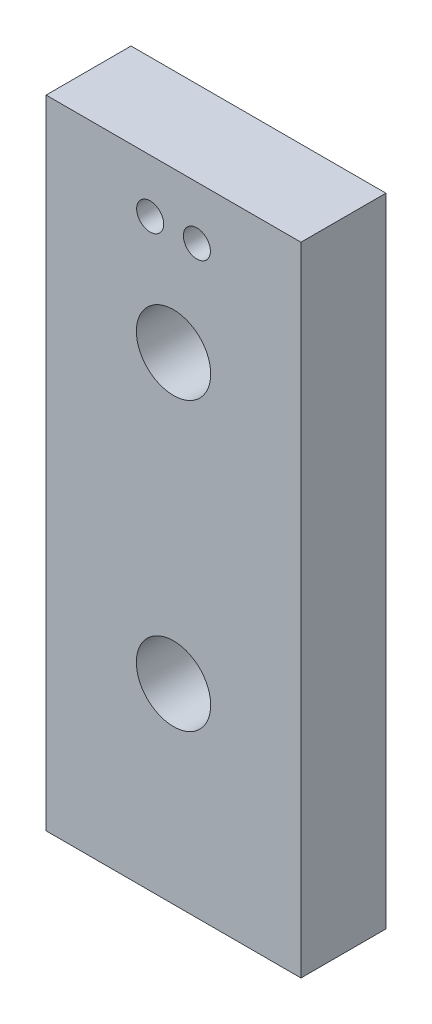
ISO-10303-21;
HEADER;
FILE_DESCRIPTION(('STEP AP214'),'2;1');
FILE_NAME('part.step','',(''),(''),'','','');
FILE_SCHEMA(('AUTOMOTIVE_DESIGN { 1 0 10303 214 1 1 1 1 }'));
ENDSEC;
DATA;
#1=APPLICATION_CONTEXT('core data for automotive mechanical design processes');
#2=APPLICATION_PROTOCOL_DEFINITION('international standard','automotive_design',2000,#1);
#3=PRODUCT_CONTEXT('',#1,'mechanical');
#4=PRODUCT('Part','Part','',(#3));
#5=PRODUCT_RELATED_PRODUCT_CATEGORY('part','',(#4));
#6=PRODUCT_DEFINITION_FORMATION('','',#4);
#7=PRODUCT_DEFINITION_CONTEXT('part definition',#1,'design');
#8=PRODUCT_DEFINITION('design','',#6,#7);
#9=PRODUCT_DEFINITION_SHAPE('','',#8);
#10=(LENGTH_UNIT() NAMED_UNIT(*) SI_UNIT(.MILLI.,.METRE.));
#11=(NAMED_UNIT(*) PLANE_ANGLE_UNIT() SI_UNIT($,.RADIAN.));
#12=(NAMED_UNIT(*) SI_UNIT($,.STERADIAN.) SOLID_ANGLE_UNIT());
#13=UNCERTAINTY_MEASURE_WITH_UNIT(LENGTH_MEASURE(1.E-05),#10,'distance_accuracy_value','');
#14=(GEOMETRIC_REPRESENTATION_CONTEXT(3) GLOBAL_UNCERTAINTY_ASSIGNED_CONTEXT((#13)) GLOBAL_UNIT_ASSIGNED_CONTEXT((#10,
#11,#12)) REPRESENTATION_CONTEXT('',''));
#15=CARTESIAN_POINT('',(0.,0.,0.));
#16=DIRECTION('',(0.,0.,1.));
#17=DIRECTION('',(1.,0.,0.));
#18=AXIS2_PLACEMENT_3D('',#15,#16,#17);
#19=CARTESIAN_POINT('',(0.,0.,12.7));
#20=DIRECTION('',(0.,0.,-1.));
#21=DIRECTION('',(-1.,0.,0.));
#22=AXIS2_PLACEMENT_3D('',#19,#20,#21);
#23=PLANE('',#22);
#24=CARTESIAN_POINT('',(-3.49250000000001,87.3125,12.7));
#25=DIRECTION('',(0.,0.,1.));
#26=DIRECTION('',(1.,0.,0.));
#27=AXIS2_PLACEMENT_3D('',#24,#25,#26);
#28=CIRCLE('',#27,2.01929999999999);
#29=CARTESIAN_POINT('',(-1.47320000000002,87.3125,12.7));
#30=VERTEX_POINT('',#29);
#31=EDGE_CURVE('E214',#30,#30,#28,.T.);
#32=ORIENTED_EDGE('',*,*,#31,.F.);
#33=EDGE_LOOP('',(#32));
#34=FACE_BOUND('',#33,.T.);
#35=CARTESIAN_POINT('',(3.49249999999999,87.3125,12.7));
#36=DIRECTION('',(0.,0.,1.));
#37=DIRECTION('',(1.,0.,0.));
#38=AXIS2_PLACEMENT_3D('',#35,#36,#37);
#39=CIRCLE('',#38,2.01929999999999);
#40=CARTESIAN_POINT('',(5.51179999999998,87.3125,12.7));
#41=VERTEX_POINT('',#40);
#42=EDGE_CURVE('E216',#41,#41,#39,.T.);
#43=ORIENTED_EDGE('',*,*,#42,.F.);
#44=EDGE_LOOP('',(#43));
#45=FACE_BOUND('',#44,.T.);
#46=CARTESIAN_POINT('',(0.,28.575,12.7));
#47=DIRECTION('',(0.,0.,1.));
#48=DIRECTION('',(1.,0.,0.));
#49=AXIS2_PLACEMENT_3D('',#46,#47,#48);
#50=CIRCLE('',#49,5.55625);
#51=CARTESIAN_POINT('',(5.55625,28.575,12.7));
#52=VERTEX_POINT('',#51);
#53=EDGE_CURVE('E134',#52,#52,#50,.T.);
#54=ORIENTED_EDGE('',*,*,#53,.F.);
#55=EDGE_LOOP('',(#54));
#56=FACE_BOUND('',#55,.T.);
#57=DIRECTION('',(0.,-1.,0.));
#58=VECTOR('',#57,1.);
#59=CARTESIAN_POINT('',(-19.05,0.,12.7));
#60=LINE('',#59,#58);
#61=CARTESIAN_POINT('',(-19.05,95.25,12.7));
#62=VERTEX_POINT('',#61);
#63=CARTESIAN_POINT('',(-19.05,0.,12.7));
#64=VERTEX_POINT('',#63);
#65=EDGE_CURVE('E140',#62,#64,#60,.T.);
#66=ORIENTED_EDGE('',*,*,#65,.T.);
#67=DIRECTION('',(1.,0.,0.));
#68=VECTOR('',#67,1.);
#69=CARTESIAN_POINT('',(-19.05,0.,12.7));
#70=LINE('',#69,#68);
#71=CARTESIAN_POINT('',(19.05,0.,12.7));
#72=VERTEX_POINT('',#71);
#73=EDGE_CURVE('E97',#64,#72,#70,.T.);
#74=ORIENTED_EDGE('',*,*,#73,.T.);
#75=DIRECTION('',(0.,1.,0.));
#76=VECTOR('',#75,1.);
#77=CARTESIAN_POINT('',(19.05,0.,12.7));
#78=LINE('',#77,#76);
#79=CARTESIAN_POINT('',(19.05,95.25,12.7));
#80=VERTEX_POINT('',#79);
#81=EDGE_CURVE('E143',#72,#80,#78,.T.);
#82=ORIENTED_EDGE('',*,*,#81,.T.);
#83=DIRECTION('',(-1.,0.,0.));
#84=VECTOR('',#83,1.);
#85=CARTESIAN_POINT('',(-19.05,95.25,12.7));
#86=LINE('',#85,#84);
#87=EDGE_CURVE('E66',#80,#62,#86,.T.);
#88=ORIENTED_EDGE('',*,*,#87,.T.);
#89=EDGE_LOOP('',(#66,#74,#82,#88));
#90=FACE_BOUND('',#89,.T.);
#91=CARTESIAN_POINT('',(0.,71.4375,12.7));
#92=DIRECTION('',(0.,0.,1.));
#93=DIRECTION('',(1.,0.,0.));
#94=AXIS2_PLACEMENT_3D('',#91,#92,#93);
#95=CIRCLE('',#94,5.55625);
#96=CARTESIAN_POINT('',(5.55625,71.4375,12.7));
#97=VERTEX_POINT('',#96);
#98=EDGE_CURVE('E128',#97,#97,#95,.T.);
#99=ORIENTED_EDGE('',*,*,#98,.F.);
#100=EDGE_LOOP('',(#99));
#101=FACE_BOUND('',#100,.T.);
#102=ADVANCED_FACE('F49',(#34,#45,#56,#90,#101),#23,.F.);
#103=CARTESIAN_POINT('',(0.,0.,0.));
#104=DIRECTION('',(0.,0.,-1.));
#105=DIRECTION('',(-1.,0.,0.));
#106=AXIS2_PLACEMENT_3D('',#103,#104,#105);
#107=PLANE('',#106);
#108=CARTESIAN_POINT('',(-3.49250000000001,87.3125,0.));
#109=DIRECTION('',(0.,0.,1.));
#110=DIRECTION('',(1.,0.,0.));
#111=AXIS2_PLACEMENT_3D('',#108,#109,#110);
#112=CIRCLE('',#111,2.0193);
#113=CARTESIAN_POINT('',(-1.47320000000001,87.3125,0.));
#114=VERTEX_POINT('',#113);
#115=EDGE_CURVE('E212',#114,#114,#112,.T.);
#116=ORIENTED_EDGE('',*,*,#115,.T.);
#117=EDGE_LOOP('',(#116));
#118=FACE_BOUND('',#117,.T.);
#119=CARTESIAN_POINT('',(3.49249999999999,87.3125,0.));
#120=DIRECTION('',(0.,0.,1.));
#121=DIRECTION('',(1.,0.,0.));
#122=AXIS2_PLACEMENT_3D('',#119,#120,#121);
#123=CIRCLE('',#122,2.0193);
#124=CARTESIAN_POINT('',(5.51179999999999,87.3125,0.));
#125=VERTEX_POINT('',#124);
#126=EDGE_CURVE('E121',#125,#125,#123,.T.);
#127=ORIENTED_EDGE('',*,*,#126,.T.);
#128=EDGE_LOOP('',(#127));
#129=FACE_BOUND('',#128,.T.);
#130=CARTESIAN_POINT('',(0.,28.575,0.));
#131=DIRECTION('',(0.,0.,1.));
#132=DIRECTION('',(1.,0.,0.));
#133=AXIS2_PLACEMENT_3D('',#130,#131,#132);
#134=CIRCLE('',#133,5.55625);
#135=CARTESIAN_POINT('',(5.55625,28.575,0.));
#136=VERTEX_POINT('',#135);
#137=EDGE_CURVE('E131',#136,#136,#134,.T.);
#138=ORIENTED_EDGE('',*,*,#137,.T.);
#139=EDGE_LOOP('',(#138));
#140=FACE_BOUND('',#139,.T.);
#141=DIRECTION('',(0.,-1.,0.));
#142=VECTOR('',#141,1.);
#143=CARTESIAN_POINT('',(-19.05,0.,0.));
#144=LINE('',#143,#142);
#145=CARTESIAN_POINT('',(-19.05,95.25,0.));
#146=VERTEX_POINT('',#145);
#147=CARTESIAN_POINT('',(-19.05,0.,0.));
#148=VERTEX_POINT('',#147);
#149=EDGE_CURVE('E137',#146,#148,#144,.T.);
#150=ORIENTED_EDGE('',*,*,#149,.F.);
#151=DIRECTION('',(-1.,0.,0.));
#152=VECTOR('',#151,1.);
#153=CARTESIAN_POINT('',(-19.05,95.25,0.));
#154=LINE('',#153,#152);
#155=CARTESIAN_POINT('',(19.05,95.25,0.));
#156=VERTEX_POINT('',#155);
#157=EDGE_CURVE('E90',#156,#146,#154,.T.);
#158=ORIENTED_EDGE('',*,*,#157,.F.);
#159=DIRECTION('',(0.,1.,0.));
#160=VECTOR('',#159,1.);
#161=CARTESIAN_POINT('',(19.05,0.,0.));
#162=LINE('',#161,#160);
#163=CARTESIAN_POINT('',(19.05,0.,0.));
#164=VERTEX_POINT('',#163);
#165=EDGE_CURVE('E84',#164,#156,#162,.T.);
#166=ORIENTED_EDGE('',*,*,#165,.F.);
#167=DIRECTION('',(1.,0.,0.));
#168=VECTOR('',#167,1.);
#169=CARTESIAN_POINT('',(-19.05,0.,0.));
#170=LINE('',#169,#168);
#171=EDGE_CURVE('E149',#148,#164,#170,.T.);
#172=ORIENTED_EDGE('',*,*,#171,.F.);
#173=EDGE_LOOP('',(#150,#158,#166,#172));
#174=FACE_BOUND('',#173,.T.);
#175=CARTESIAN_POINT('',(0.,71.4375,0.));
#176=DIRECTION('',(0.,0.,1.));
#177=DIRECTION('',(1.,0.,0.));
#178=AXIS2_PLACEMENT_3D('',#175,#176,#177);
#179=CIRCLE('',#178,5.55625);
#180=CARTESIAN_POINT('',(5.55625,71.4375,0.));
#181=VERTEX_POINT('',#180);
#182=EDGE_CURVE('E127',#181,#181,#179,.T.);
#183=ORIENTED_EDGE('',*,*,#182,.T.);
#184=EDGE_LOOP('',(#183));
#185=FACE_BOUND('',#184,.T.);
#186=ADVANCED_FACE('F159',(#118,#129,#140,#174,#185),#107,.T.);
#187=CARTESIAN_POINT('',(-19.05,0.,12.7));
#188=DIRECTION('',(1.,0.,0.));
#189=DIRECTION('',(0.,0.,-1.));
#190=AXIS2_PLACEMENT_3D('',#187,#188,#189);
#191=PLANE('',#190);
#192=ORIENTED_EDGE('',*,*,#149,.T.);
#193=DIRECTION('',(0.,0.,-1.));
#194=VECTOR('',#193,1.);
#195=CARTESIAN_POINT('',(-19.05,0.,12.7));
#196=LINE('',#195,#194);
#197=EDGE_CURVE('E13',#64,#148,#196,.T.);
#198=ORIENTED_EDGE('',*,*,#197,.F.);
#199=ORIENTED_EDGE('',*,*,#65,.F.);
#200=DIRECTION('',(0.,0.,-1.));
#201=VECTOR('',#200,1.);
#202=CARTESIAN_POINT('',(-19.05,95.25,12.7));
#203=LINE('',#202,#201);
#204=EDGE_CURVE('E146',#62,#146,#203,.T.);
#205=ORIENTED_EDGE('',*,*,#204,.T.);
#206=EDGE_LOOP('',(#192,#198,#199,#205));
#207=FACE_BOUND('',#206,.T.);
#208=ADVANCED_FACE('F51',(#207),#191,.F.);
#209=CARTESIAN_POINT('',(-19.05,0.,12.7));
#210=DIRECTION('',(0.,1.,0.));
#211=DIRECTION('',(-1.,0.,0.));
#212=AXIS2_PLACEMENT_3D('',#209,#210,#211);
#213=PLANE('',#212);
#214=CARTESIAN_POINT('',(-13.97,0.,6.35));
#215=DIRECTION('',(0.,-1.,0.));
#216=DIRECTION('',(0.,0.,-1.));
#217=AXIS2_PLACEMENT_3D('',#214,#215,#216);
#218=CIRCLE('',#217,2.01929999999999);
#219=CARTESIAN_POINT('',(-13.97,0.,4.33070000000001));
#220=VERTEX_POINT('',#219);
#221=EDGE_CURVE('E115',#220,#220,#218,.T.);
#222=ORIENTED_EDGE('',*,*,#221,.F.);
#223=EDGE_LOOP('',(#222));
#224=FACE_BOUND('',#223,.T.);
#225=CARTESIAN_POINT('',(13.97,0.,6.35));
#226=DIRECTION('',(0.,-1.,0.));
#227=DIRECTION('',(0.,0.,-1.));
#228=AXIS2_PLACEMENT_3D('',#225,#226,#227);
#229=CIRCLE('',#228,2.01929999999999);
#230=CARTESIAN_POINT('',(13.97,0.,4.33070000000001));
#231=VERTEX_POINT('',#230);
#232=EDGE_CURVE('E114',#231,#231,#229,.T.);
#233=ORIENTED_EDGE('',*,*,#232,.F.);
#234=EDGE_LOOP('',(#233));
#235=FACE_BOUND('',#234,.T.);
#236=ORIENTED_EDGE('',*,*,#171,.T.);
#237=DIRECTION('',(0.,0.,-1.));
#238=VECTOR('',#237,1.);
#239=CARTESIAN_POINT('',(19.05,0.,12.7));
#240=LINE('',#239,#238);
#241=EDGE_CURVE('E58',#72,#164,#240,.T.);
#242=ORIENTED_EDGE('',*,*,#241,.F.);
#243=ORIENTED_EDGE('',*,*,#73,.F.);
#244=ORIENTED_EDGE('',*,*,#197,.T.);
#245=EDGE_LOOP('',(#236,#242,#243,#244));
#246=FACE_BOUND('',#245,.T.);
#247=ADVANCED_FACE('F175',(#224,#235,#246),#213,.F.);
#248=CARTESIAN_POINT('',(19.05,0.,12.7));
#249=DIRECTION('',(-1.,0.,0.));
#250=DIRECTION('',(0.,-1.,0.));
#251=AXIS2_PLACEMENT_3D('',#248,#249,#250);
#252=PLANE('',#251);
#253=ORIENTED_EDGE('',*,*,#165,.T.);
#254=DIRECTION('',(0.,0.,-1.));
#255=VECTOR('',#254,1.);
#256=CARTESIAN_POINT('',(19.05,95.25,12.7));
#257=LINE('',#256,#255);
#258=EDGE_CURVE('E154',#80,#156,#257,.T.);
#259=ORIENTED_EDGE('',*,*,#258,.F.);
#260=ORIENTED_EDGE('',*,*,#81,.F.);
#261=ORIENTED_EDGE('',*,*,#241,.T.);
#262=EDGE_LOOP('',(#253,#259,#260,#261));
#263=FACE_BOUND('',#262,.T.);
#264=ADVANCED_FACE('F156',(#263),#252,.F.);
#265=CARTESIAN_POINT('',(-19.05,95.25,12.7));
#266=DIRECTION('',(0.,-1.,0.));
#267=DIRECTION('',(0.,0.,-1.));
#268=AXIS2_PLACEMENT_3D('',#265,#266,#267);
#269=PLANE('',#268);
#270=ORIENTED_EDGE('',*,*,#157,.T.);
#271=ORIENTED_EDGE('',*,*,#204,.F.);
#272=ORIENTED_EDGE('',*,*,#87,.F.);
#273=ORIENTED_EDGE('',*,*,#258,.T.);
#274=EDGE_LOOP('',(#270,#271,#272,#273));
#275=FACE_BOUND('',#274,.T.);
#276=ADVANCED_FACE('F164',(#275),#269,.F.);
#277=CARTESIAN_POINT('',(0.,28.575,12.7));
#278=DIRECTION('',(0.,0.,-1.));
#279=DIRECTION('',(-1.,0.,0.));
#280=AXIS2_PLACEMENT_3D('',#277,#278,#279);
#281=CYLINDRICAL_SURFACE('',#280,5.55625);
#282=ORIENTED_EDGE('',*,*,#53,.T.);
#283=EDGE_LOOP('',(#282));
#284=FACE_BOUND('',#283,.T.);
#285=ORIENTED_EDGE('',*,*,#137,.F.);
#286=EDGE_LOOP('',(#285));
#287=FACE_BOUND('',#286,.T.);
#288=ADVANCED_FACE('F166',(#284,#287),#281,.F.);
#289=CARTESIAN_POINT('',(0.,71.4375,12.7));
#290=DIRECTION('',(0.,0.,-1.));
#291=DIRECTION('',(-1.,0.,0.));
#292=AXIS2_PLACEMENT_3D('',#289,#290,#291);
#293=CYLINDRICAL_SURFACE('',#292,5.55625);
#294=ORIENTED_EDGE('',*,*,#98,.T.);
#295=EDGE_LOOP('',(#294));
#296=FACE_BOUND('',#295,.T.);
#297=ORIENTED_EDGE('',*,*,#182,.F.);
#298=EDGE_LOOP('',(#297));
#299=FACE_BOUND('',#298,.T.);
#300=ADVANCED_FACE('F172',(#296,#299),#293,.F.);
#301=CARTESIAN_POINT('',(13.97,15.875,6.35));
#302=DIRECTION('',(0.,-1.,0.));
#303=DIRECTION('',(0.,0.,-1.));
#304=AXIS2_PLACEMENT_3D('',#301,#302,#303);
#305=CONICAL_SURFACE('',#304,2.01929999999999,1.02974425867665);
#306=CARTESIAN_POINT('',(13.97,17.0883178480024,6.35));
#307=VERTEX_POINT('',#306);
#308=VERTEX_LOOP('',#307);
#309=FACE_BOUND('',#308,.T.);
#310=CARTESIAN_POINT('',(13.97,15.875,6.35));
#311=DIRECTION('',(0.,-1.,0.));
#312=DIRECTION('',(0.,0.,-1.));
#313=AXIS2_PLACEMENT_3D('',#310,#311,#312);
#314=CIRCLE('',#313,2.01929999999999);
#315=CARTESIAN_POINT('',(13.97,15.875,4.3307));
#316=VERTEX_POINT('',#315);
#317=EDGE_CURVE('E118',#316,#316,#314,.T.);
#318=ORIENTED_EDGE('',*,*,#317,.T.);
#319=EDGE_LOOP('',(#318));
#320=FACE_BOUND('',#319,.T.);
#321=ADVANCED_FACE('F190',(#309,#320),#305,.F.);
#322=CARTESIAN_POINT('',(13.97,0.,6.35));
#323=DIRECTION('',(0.,-1.,0.));
#324=DIRECTION('',(0.,0.,-1.));
#325=AXIS2_PLACEMENT_3D('',#322,#323,#324);
#326=CYLINDRICAL_SURFACE('',#325,2.01929999999999);
#327=ORIENTED_EDGE('',*,*,#317,.F.);
#328=EDGE_LOOP('',(#327));
#329=FACE_BOUND('',#328,.T.);
#330=ORIENTED_EDGE('',*,*,#232,.T.);
#331=EDGE_LOOP('',(#330));
#332=FACE_BOUND('',#331,.T.);
#333=ADVANCED_FACE('F108',(#329,#332),#326,.F.);
#334=CARTESIAN_POINT('',(-13.97,15.875,6.35));
#335=DIRECTION('',(0.,-1.,0.));
#336=DIRECTION('',(0.,0.,-1.));
#337=AXIS2_PLACEMENT_3D('',#334,#335,#336);
#338=CONICAL_SURFACE('',#337,2.0193,1.02974425867665);
#339=CARTESIAN_POINT('',(-13.97,17.0883178480024,6.35));
#340=VERTEX_POINT('',#339);
#341=VERTEX_LOOP('',#340);
#342=FACE_BOUND('',#341,.T.);
#343=CARTESIAN_POINT('',(-13.97,15.875,6.35));
#344=DIRECTION('',(0.,-1.,0.));
#345=DIRECTION('',(0.,0.,-1.));
#346=AXIS2_PLACEMENT_3D('',#343,#344,#345);
#347=CIRCLE('',#346,2.0193);
#348=CARTESIAN_POINT('',(-13.97,15.875,4.3307));
#349=VERTEX_POINT('',#348);
#350=EDGE_CURVE('E112',#349,#349,#347,.T.);
#351=ORIENTED_EDGE('',*,*,#350,.T.);
#352=EDGE_LOOP('',(#351));
#353=FACE_BOUND('',#352,.T.);
#354=ADVANCED_FACE('F104',(#342,#353),#338,.F.);
#355=CARTESIAN_POINT('',(-13.97,0.,6.35));
#356=DIRECTION('',(0.,-1.,0.));
#357=DIRECTION('',(0.,0.,-1.));
#358=AXIS2_PLACEMENT_3D('',#355,#356,#357);
#359=CYLINDRICAL_SURFACE('',#358,2.01929999999999);
#360=ORIENTED_EDGE('',*,*,#350,.F.);
#361=EDGE_LOOP('',(#360));
#362=FACE_BOUND('',#361,.T.);
#363=ORIENTED_EDGE('',*,*,#221,.T.);
#364=EDGE_LOOP('',(#363));
#365=FACE_BOUND('',#364,.T.);
#366=ADVANCED_FACE('F107',(#362,#365),#359,.F.);
#367=CARTESIAN_POINT('',(3.49249999999999,87.3125,12.7));
#368=DIRECTION('',(0.,0.,1.));
#369=DIRECTION('',(1.,0.,0.));
#370=AXIS2_PLACEMENT_3D('',#367,#368,#369);
#371=CYLINDRICAL_SURFACE('',#370,2.01929999999999);
#372=ORIENTED_EDGE('',*,*,#126,.F.);
#373=EDGE_LOOP('',(#372));
#374=FACE_BOUND('',#373,.T.);
#375=ORIENTED_EDGE('',*,*,#42,.T.);
#376=EDGE_LOOP('',(#375));
#377=FACE_BOUND('',#376,.T.);
#378=ADVANCED_FACE('F200',(#374,#377),#371,.F.);
#379=CARTESIAN_POINT('',(-3.49250000000001,87.3125,12.7));
#380=DIRECTION('',(0.,0.,1.));
#381=DIRECTION('',(1.,0.,0.));
#382=AXIS2_PLACEMENT_3D('',#379,#380,#381);
#383=CYLINDRICAL_SURFACE('',#382,2.01929999999999);
#384=ORIENTED_EDGE('',*,*,#115,.F.);
#385=EDGE_LOOP('',(#384));
#386=FACE_BOUND('',#385,.T.);
#387=ORIENTED_EDGE('',*,*,#31,.T.);
#388=EDGE_LOOP('',(#387));
#389=FACE_BOUND('',#388,.T.);
#390=ADVANCED_FACE('F203',(#386,#389),#383,.F.);
#391=CLOSED_SHELL('',(#102,#186,#208,#247,#264,#276,#288,#300,#321,#333,#354,#366,#378,#390));
#392=MANIFOLD_SOLID_BREP('B2',#391);
#393=ADVANCED_BREP_SHAPE_REPRESENTATION('',(#18,#392),#14);
#394=SHAPE_DEFINITION_REPRESENTATION(#9,#393);
ENDSEC;
END-ISO-10303-21;
